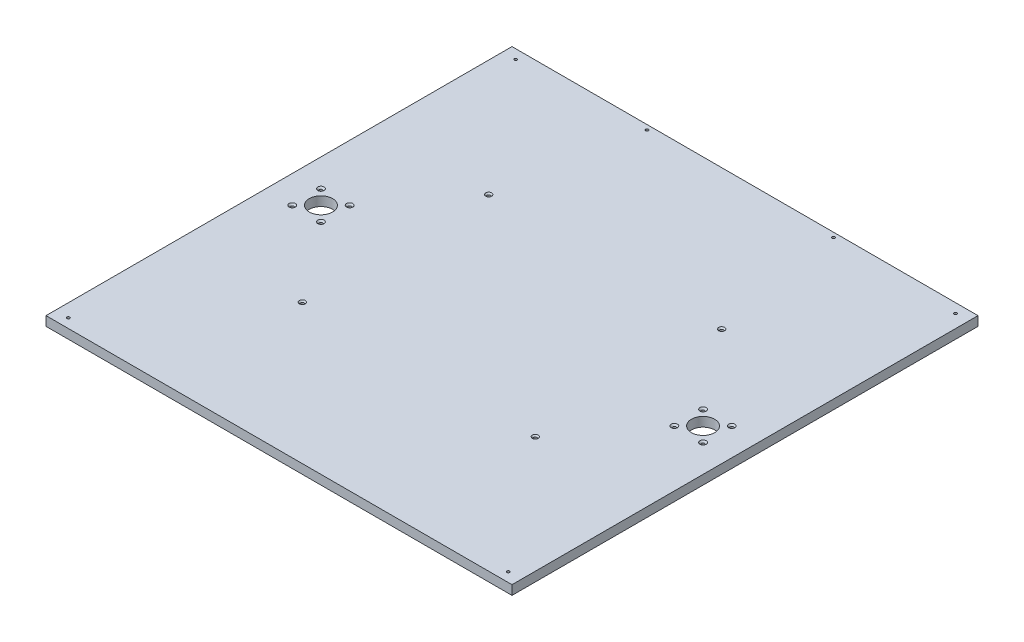
ISO-10303-21;
HEADER;
FILE_DESCRIPTION(('STEP AP214'),'2;1');
FILE_NAME('part.step','',(''),(''),'','','');
FILE_SCHEMA(('AUTOMOTIVE_DESIGN { 1 0 10303 214 1 1 1 1 }'));
ENDSEC;
DATA;
#1=APPLICATION_CONTEXT('core data for automotive mechanical design processes');
#2=APPLICATION_PROTOCOL_DEFINITION('international standard','automotive_design',2000,#1);
#3=PRODUCT_CONTEXT('',#1,'mechanical');
#4=PRODUCT('Part','Part','',(#3));
#5=PRODUCT_RELATED_PRODUCT_CATEGORY('part','',(#4));
#6=PRODUCT_DEFINITION_FORMATION('','',#4);
#7=PRODUCT_DEFINITION_CONTEXT('part definition',#1,'design');
#8=PRODUCT_DEFINITION('design','',#6,#7);
#9=PRODUCT_DEFINITION_SHAPE('','',#8);
#10=(LENGTH_UNIT() NAMED_UNIT(*) SI_UNIT(.MILLI.,.METRE.));
#11=(NAMED_UNIT(*) PLANE_ANGLE_UNIT() SI_UNIT($,.RADIAN.));
#12=(NAMED_UNIT(*) SI_UNIT($,.STERADIAN.) SOLID_ANGLE_UNIT());
#13=UNCERTAINTY_MEASURE_WITH_UNIT(LENGTH_MEASURE(1.E-05),#10,'distance_accuracy_value','');
#14=(GEOMETRIC_REPRESENTATION_CONTEXT(3) GLOBAL_UNCERTAINTY_ASSIGNED_CONTEXT((#13)) GLOBAL_UNIT_ASSIGNED_CONTEXT((#10,
#11,#12)) REPRESENTATION_CONTEXT('',''));
#15=CARTESIAN_POINT('',(0.,0.,0.));
#16=DIRECTION('',(0.,0.,1.));
#17=DIRECTION('',(1.,0.,0.));
#18=AXIS2_PLACEMENT_3D('',#15,#16,#17);
#19=CARTESIAN_POINT('',(0.,10.,0.));
#20=DIRECTION('',(1.,0.,0.));
#21=DIRECTION('',(0.,0.,-1.));
#22=AXIS2_PLACEMENT_3D('',#19,#20,#21);
#23=PLANE('',#22);
#24=DIRECTION('',(0.,0.,1.));
#25=VECTOR('',#24,1.);
#26=CARTESIAN_POINT('',(0.,0.,0.));
#27=LINE('',#26,#25);
#28=CARTESIAN_POINT('',(0.,0.,-500.));
#29=VERTEX_POINT('',#28);
#30=CARTESIAN_POINT('',(0.,0.,0.));
#31=VERTEX_POINT('',#30);
#32=EDGE_CURVE('E103',#29,#31,#27,.T.);
#33=ORIENTED_EDGE('',*,*,#32,.T.);
#34=DIRECTION('',(0.,-1.,0.));
#35=VECTOR('',#34,1.);
#36=CARTESIAN_POINT('',(0.,10.,0.));
#37=LINE('',#36,#35);
#38=CARTESIAN_POINT('',(0.,10.,0.));
#39=VERTEX_POINT('',#38);
#40=EDGE_CURVE('E11',#39,#31,#37,.T.);
#41=ORIENTED_EDGE('',*,*,#40,.F.);
#42=DIRECTION('',(0.,0.,1.));
#43=VECTOR('',#42,1.);
#44=CARTESIAN_POINT('',(0.,10.,0.));
#45=LINE('',#44,#43);
#46=CARTESIAN_POINT('',(0.,10.,-500.));
#47=VERTEX_POINT('',#46);
#48=EDGE_CURVE('E91',#47,#39,#45,.T.);
#49=ORIENTED_EDGE('',*,*,#48,.F.);
#50=DIRECTION('',(0.,-1.,0.));
#51=VECTOR('',#50,1.);
#52=CARTESIAN_POINT('',(0.,10.,-500.));
#53=LINE('',#52,#51);
#54=EDGE_CURVE('E99',#47,#29,#53,.T.);
#55=ORIENTED_EDGE('',*,*,#54,.T.);
#56=EDGE_LOOP('',(#33,#41,#49,#55));
#57=FACE_BOUND('',#56,.T.);
#58=ADVANCED_FACE('F40',(#57),#23,.F.);
#59=CARTESIAN_POINT('',(0.,10.,0.));
#60=DIRECTION('',(0.,0.,-1.));
#61=DIRECTION('',(-1.,0.,0.));
#62=AXIS2_PLACEMENT_3D('',#59,#60,#61);
#63=PLANE('',#62);
#64=DIRECTION('',(1.,0.,0.));
#65=VECTOR('',#64,1.);
#66=CARTESIAN_POINT('',(0.,0.,0.));
#67=LINE('',#66,#65);
#68=CARTESIAN_POINT('',(500.,0.,0.));
#69=VERTEX_POINT('',#68);
#70=EDGE_CURVE('E95',#31,#69,#67,.T.);
#71=ORIENTED_EDGE('',*,*,#70,.T.);
#72=DIRECTION('',(0.,-1.,0.));
#73=VECTOR('',#72,1.);
#74=CARTESIAN_POINT('',(500.,10.,0.));
#75=LINE('',#74,#73);
#76=CARTESIAN_POINT('',(500.,10.,0.));
#77=VERTEX_POINT('',#76);
#78=EDGE_CURVE('E48',#77,#69,#75,.T.);
#79=ORIENTED_EDGE('',*,*,#78,.F.);
#80=DIRECTION('',(1.,0.,0.));
#81=VECTOR('',#80,1.);
#82=CARTESIAN_POINT('',(0.,10.,0.));
#83=LINE('',#82,#81);
#84=EDGE_CURVE('E86',#39,#77,#83,.T.);
#85=ORIENTED_EDGE('',*,*,#84,.F.);
#86=ORIENTED_EDGE('',*,*,#40,.T.);
#87=EDGE_LOOP('',(#71,#79,#85,#86));
#88=FACE_BOUND('',#87,.T.);
#89=ADVANCED_FACE('F94',(#88),#63,.F.);
#90=CARTESIAN_POINT('',(500.,10.,0.));
#91=DIRECTION('',(-1.,0.,0.));
#92=DIRECTION('',(0.,0.,1.));
#93=AXIS2_PLACEMENT_3D('',#90,#91,#92);
#94=PLANE('',#93);
#95=DIRECTION('',(0.,0.,-1.));
#96=VECTOR('',#95,1.);
#97=CARTESIAN_POINT('',(500.,0.,0.));
#98=LINE('',#97,#96);
#99=CARTESIAN_POINT('',(500.,0.,-500.));
#100=VERTEX_POINT('',#99);
#101=EDGE_CURVE('E73',#69,#100,#98,.T.);
#102=ORIENTED_EDGE('',*,*,#101,.T.);
#103=DIRECTION('',(0.,-1.,0.));
#104=VECTOR('',#103,1.);
#105=CARTESIAN_POINT('',(500.,10.,-500.));
#106=LINE('',#105,#104);
#107=CARTESIAN_POINT('',(500.,10.,-500.));
#108=VERTEX_POINT('',#107);
#109=EDGE_CURVE('E96',#108,#100,#106,.T.);
#110=ORIENTED_EDGE('',*,*,#109,.F.);
#111=DIRECTION('',(0.,0.,-1.));
#112=VECTOR('',#111,1.);
#113=CARTESIAN_POINT('',(500.,10.,0.));
#114=LINE('',#113,#112);
#115=EDGE_CURVE('E89',#77,#108,#114,.T.);
#116=ORIENTED_EDGE('',*,*,#115,.F.);
#117=ORIENTED_EDGE('',*,*,#78,.T.);
#118=EDGE_LOOP('',(#102,#110,#116,#117));
#119=FACE_BOUND('',#118,.T.);
#120=ADVANCED_FACE('F97',(#119),#94,.F.);
#121=CARTESIAN_POINT('',(0.,10.,-500.));
#122=DIRECTION('',(0.,0.,1.));
#123=DIRECTION('',(1.,0.,0.));
#124=AXIS2_PLACEMENT_3D('',#121,#122,#123);
#125=PLANE('',#124);
#126=DIRECTION('',(-1.,0.,0.));
#127=VECTOR('',#126,1.);
#128=CARTESIAN_POINT('',(0.,0.,-500.));
#129=LINE('',#128,#127);
#130=EDGE_CURVE('E79',#100,#29,#129,.T.);
#131=ORIENTED_EDGE('',*,*,#130,.T.);
#132=ORIENTED_EDGE('',*,*,#54,.F.);
#133=DIRECTION('',(-1.,0.,0.));
#134=VECTOR('',#133,1.);
#135=CARTESIAN_POINT('',(0.,10.,-500.));
#136=LINE('',#135,#134);
#137=EDGE_CURVE('E56',#108,#47,#136,.T.);
#138=ORIENTED_EDGE('',*,*,#137,.F.);
#139=ORIENTED_EDGE('',*,*,#109,.T.);
#140=EDGE_LOOP('',(#131,#132,#138,#139));
#141=FACE_BOUND('',#140,.T.);
#142=ADVANCED_FACE('F111',(#141),#125,.F.);
#143=CARTESIAN_POINT('',(0.,10.,0.));
#144=DIRECTION('',(0.,-1.,0.));
#145=DIRECTION('',(0.,0.,-1.));
#146=AXIS2_PLACEMENT_3D('',#143,#144,#145);
#147=PLANE('',#146);
#148=CARTESIAN_POINT('',(150.,9.99999999999999,-495.));
#149=DIRECTION('',(0.,-1.,0.));
#150=DIRECTION('',(0.,0.,-1.));
#151=AXIS2_PLACEMENT_3D('',#148,#149,#150);
#152=CIRCLE('',#151,1.5);
#153=CARTESIAN_POINT('',(150.,9.99999999999999,-496.5));
#154=VERTEX_POINT('',#153);
#155=EDGE_CURVE('E266',#154,#154,#152,.T.);
#156=ORIENTED_EDGE('',*,*,#155,.T.);
#157=EDGE_LOOP('',(#156));
#158=FACE_BOUND('',#157,.T.);
#159=CARTESIAN_POINT('',(350.,9.99999999999999,-495.));
#160=DIRECTION('',(0.,-1.,0.));
#161=DIRECTION('',(0.,0.,-1.));
#162=AXIS2_PLACEMENT_3D('',#159,#160,#161);
#163=CIRCLE('',#162,1.5);
#164=CARTESIAN_POINT('',(350.,9.99999999999999,-496.5));
#165=VERTEX_POINT('',#164);
#166=EDGE_CURVE('E260',#165,#165,#163,.T.);
#167=ORIENTED_EDGE('',*,*,#166,.T.);
#168=EDGE_LOOP('',(#167));
#169=FACE_BOUND('',#168,.T.);
#170=CARTESIAN_POINT('',(485.999999999998,10.,-490.));
#171=DIRECTION('',(0.,-1.,0.));
#172=DIRECTION('',(0.,0.,-1.));
#173=AXIS2_PLACEMENT_3D('',#170,#171,#172);
#174=CIRCLE('',#173,1.5);
#175=CARTESIAN_POINT('',(485.999999999998,10.,-491.5));
#176=VERTEX_POINT('',#175);
#177=EDGE_CURVE('E254',#176,#176,#174,.T.);
#178=ORIENTED_EDGE('',*,*,#177,.T.);
#179=EDGE_LOOP('',(#178));
#180=FACE_BOUND('',#179,.T.);
#181=CARTESIAN_POINT('',(485.999999999998,10.,-10.));
#182=DIRECTION('',(0.,-1.,0.));
#183=DIRECTION('',(0.,0.,-1.));
#184=AXIS2_PLACEMENT_3D('',#181,#182,#183);
#185=CIRCLE('',#184,1.5);
#186=CARTESIAN_POINT('',(485.999999999998,10.,-11.5));
#187=VERTEX_POINT('',#186);
#188=EDGE_CURVE('E248',#187,#187,#185,.T.);
#189=ORIENTED_EDGE('',*,*,#188,.T.);
#190=EDGE_LOOP('',(#189));
#191=FACE_BOUND('',#190,.T.);
#192=CARTESIAN_POINT('',(14.0000000000014,10.,-10.));
#193=DIRECTION('',(0.,-1.,0.));
#194=DIRECTION('',(0.,0.,-1.));
#195=AXIS2_PLACEMENT_3D('',#192,#193,#194);
#196=CIRCLE('',#195,1.5);
#197=CARTESIAN_POINT('',(14.0000000000014,10.,-11.5));
#198=VERTEX_POINT('',#197);
#199=EDGE_CURVE('E242',#198,#198,#196,.T.);
#200=ORIENTED_EDGE('',*,*,#199,.T.);
#201=EDGE_LOOP('',(#200));
#202=FACE_BOUND('',#201,.T.);
#203=CARTESIAN_POINT('',(14.0000000000014,10.,-490.));
#204=DIRECTION('',(0.,-1.,0.));
#205=DIRECTION('',(0.,0.,-1.));
#206=AXIS2_PLACEMENT_3D('',#203,#204,#205);
#207=CIRCLE('',#206,1.5);
#208=CARTESIAN_POINT('',(14.0000000000014,10.,-491.5));
#209=VERTEX_POINT('',#208);
#210=EDGE_CURVE('E236',#209,#209,#207,.T.);
#211=ORIENTED_EDGE('',*,*,#210,.T.);
#212=EDGE_LOOP('',(#211));
#213=FACE_BOUND('',#212,.T.);
#214=CARTESIAN_POINT('',(374.999999999999,10.,-350.));
#215=DIRECTION('',(0.,1.,0.));
#216=DIRECTION('',(0.,0.,1.));
#217=AXIS2_PLACEMENT_3D('',#214,#215,#216);
#218=CIRCLE('',#217,3.14999999999999);
#219=CARTESIAN_POINT('',(374.999999999999,10.,-346.85));
#220=VERTEX_POINT('',#219);
#221=EDGE_CURVE('E233',#220,#220,#218,.T.);
#222=ORIENTED_EDGE('',*,*,#221,.F.);
#223=EDGE_LOOP('',(#222));
#224=FACE_BOUND('',#223,.T.);
#225=CARTESIAN_POINT('',(375.,10.,-150.));
#226=DIRECTION('',(0.,1.,0.));
#227=DIRECTION('',(0.,0.,1.));
#228=AXIS2_PLACEMENT_3D('',#225,#226,#227);
#229=CIRCLE('',#228,3.14999999999999);
#230=CARTESIAN_POINT('',(375.,10.,-146.85));
#231=VERTEX_POINT('',#230);
#232=EDGE_CURVE('E224',#231,#231,#229,.T.);
#233=ORIENTED_EDGE('',*,*,#232,.F.);
#234=EDGE_LOOP('',(#233));
#235=FACE_BOUND('',#234,.T.);
#236=CARTESIAN_POINT('',(124.999999999999,10.,-350.));
#237=DIRECTION('',(0.,1.,0.));
#238=DIRECTION('',(0.,0.,1.));
#239=AXIS2_PLACEMENT_3D('',#236,#237,#238);
#240=CIRCLE('',#239,3.15);
#241=CARTESIAN_POINT('',(124.999999999999,10.,-346.85));
#242=VERTEX_POINT('',#241);
#243=EDGE_CURVE('E215',#242,#242,#240,.T.);
#244=ORIENTED_EDGE('',*,*,#243,.F.);
#245=EDGE_LOOP('',(#244));
#246=FACE_BOUND('',#245,.T.);
#247=CARTESIAN_POINT('',(125.,10.,-150.));
#248=DIRECTION('',(0.,1.,0.));
#249=DIRECTION('',(0.,0.,1.));
#250=AXIS2_PLACEMENT_3D('',#247,#248,#249);
#251=CIRCLE('',#250,3.14999999999999);
#252=CARTESIAN_POINT('',(125.,10.,-146.85));
#253=VERTEX_POINT('',#252);
#254=EDGE_CURVE('E206',#253,#253,#251,.T.);
#255=ORIENTED_EDGE('',*,*,#254,.F.);
#256=EDGE_LOOP('',(#255));
#257=FACE_BOUND('',#256,.T.);
#258=CARTESIAN_POINT('',(439.6,10.,-265.4));
#259=DIRECTION('',(0.,1.,0.));
#260=DIRECTION('',(0.,0.,1.));
#261=AXIS2_PLACEMENT_3D('',#258,#259,#260);
#262=CIRCLE('',#261,3.35999999999997);
#263=CARTESIAN_POINT('',(439.6,10.,-262.04));
#264=VERTEX_POINT('',#263);
#265=EDGE_CURVE('E197',#264,#264,#262,.T.);
#266=ORIENTED_EDGE('',*,*,#265,.F.);
#267=EDGE_LOOP('',(#266));
#268=FACE_BOUND('',#267,.T.);
#269=CARTESIAN_POINT('',(439.6,10.,-234.6));
#270=DIRECTION('',(0.,1.,0.));
#271=DIRECTION('',(0.,0.,1.));
#272=AXIS2_PLACEMENT_3D('',#269,#270,#271);
#273=CIRCLE('',#272,3.35999999999997);
#274=CARTESIAN_POINT('',(439.6,10.,-231.24));
#275=VERTEX_POINT('',#274);
#276=EDGE_CURVE('E188',#275,#275,#273,.T.);
#277=ORIENTED_EDGE('',*,*,#276,.F.);
#278=EDGE_LOOP('',(#277));
#279=FACE_BOUND('',#278,.T.);
#280=CARTESIAN_POINT('',(470.4,10.,-234.6));
#281=DIRECTION('',(0.,1.,0.));
#282=DIRECTION('',(0.,0.,1.));
#283=AXIS2_PLACEMENT_3D('',#280,#281,#282);
#284=CIRCLE('',#283,3.35999999999997);
#285=CARTESIAN_POINT('',(470.4,10.,-231.24));
#286=VERTEX_POINT('',#285);
#287=EDGE_CURVE('E179',#286,#286,#284,.T.);
#288=ORIENTED_EDGE('',*,*,#287,.F.);
#289=EDGE_LOOP('',(#288));
#290=FACE_BOUND('',#289,.T.);
#291=CARTESIAN_POINT('',(470.4,10.,-265.4));
#292=DIRECTION('',(0.,1.,0.));
#293=DIRECTION('',(0.,0.,1.));
#294=AXIS2_PLACEMENT_3D('',#291,#292,#293);
#295=CIRCLE('',#294,3.35999999999997);
#296=CARTESIAN_POINT('',(470.4,10.,-262.04));
#297=VERTEX_POINT('',#296);
#298=EDGE_CURVE('E170',#297,#297,#295,.T.);
#299=ORIENTED_EDGE('',*,*,#298,.F.);
#300=EDGE_LOOP('',(#299));
#301=FACE_BOUND('',#300,.T.);
#302=CARTESIAN_POINT('',(60.4,10.,-234.6));
#303=DIRECTION('',(0.,1.,0.));
#304=DIRECTION('',(0.,0.,1.));
#305=AXIS2_PLACEMENT_3D('',#302,#303,#304);
#306=CIRCLE('',#305,3.36);
#307=CARTESIAN_POINT('',(60.4,10.,-231.24));
#308=VERTEX_POINT('',#307);
#309=EDGE_CURVE('E161',#308,#308,#306,.T.);
#310=ORIENTED_EDGE('',*,*,#309,.F.);
#311=EDGE_LOOP('',(#310));
#312=FACE_BOUND('',#311,.T.);
#313=CARTESIAN_POINT('',(60.4,10.,-265.4));
#314=DIRECTION('',(0.,1.,0.));
#315=DIRECTION('',(0.,0.,1.));
#316=AXIS2_PLACEMENT_3D('',#313,#314,#315);
#317=CIRCLE('',#316,3.36);
#318=CARTESIAN_POINT('',(60.4,10.,-262.04));
#319=VERTEX_POINT('',#318);
#320=EDGE_CURVE('E152',#319,#319,#317,.T.);
#321=ORIENTED_EDGE('',*,*,#320,.F.);
#322=EDGE_LOOP('',(#321));
#323=FACE_BOUND('',#322,.T.);
#324=CARTESIAN_POINT('',(29.6,10.,-234.6));
#325=DIRECTION('',(0.,1.,0.));
#326=DIRECTION('',(0.,0.,1.));
#327=AXIS2_PLACEMENT_3D('',#324,#325,#326);
#328=CIRCLE('',#327,3.36);
#329=CARTESIAN_POINT('',(29.6,10.,-231.24));
#330=VERTEX_POINT('',#329);
#331=EDGE_CURVE('E143',#330,#330,#328,.T.);
#332=ORIENTED_EDGE('',*,*,#331,.F.);
#333=EDGE_LOOP('',(#332));
#334=FACE_BOUND('',#333,.T.);
#335=CARTESIAN_POINT('',(29.6,10.,-265.4));
#336=DIRECTION('',(0.,1.,0.));
#337=DIRECTION('',(0.,0.,1.));
#338=AXIS2_PLACEMENT_3D('',#335,#336,#337);
#339=CIRCLE('',#338,3.36);
#340=CARTESIAN_POINT('',(29.6,10.,-262.04));
#341=VERTEX_POINT('',#340);
#342=EDGE_CURVE('E134',#341,#341,#339,.T.);
#343=ORIENTED_EDGE('',*,*,#342,.F.);
#344=EDGE_LOOP('',(#343));
#345=FACE_BOUND('',#344,.T.);
#346=CARTESIAN_POINT('',(45.,10.,-250.));
#347=DIRECTION('',(0.,1.,0.));
#348=DIRECTION('',(0.,0.,1.));
#349=AXIS2_PLACEMENT_3D('',#346,#347,#348);
#350=CIRCLE('',#349,12.5);
#351=CARTESIAN_POINT('',(45.,10.,-237.5));
#352=VERTEX_POINT('',#351);
#353=EDGE_CURVE('E124',#352,#352,#350,.T.);
#354=ORIENTED_EDGE('',*,*,#353,.F.);
#355=EDGE_LOOP('',(#354));
#356=FACE_BOUND('',#355,.T.);
#357=CARTESIAN_POINT('',(455.,10.,-250.));
#358=DIRECTION('',(0.,1.,0.));
#359=DIRECTION('',(0.,0.,1.));
#360=AXIS2_PLACEMENT_3D('',#357,#358,#359);
#361=CIRCLE('',#360,12.5);
#362=CARTESIAN_POINT('',(455.,10.,-237.5));
#363=VERTEX_POINT('',#362);
#364=EDGE_CURVE('E117',#363,#363,#361,.T.);
#365=ORIENTED_EDGE('',*,*,#364,.F.);
#366=EDGE_LOOP('',(#365));
#367=FACE_BOUND('',#366,.T.);
#368=ORIENTED_EDGE('',*,*,#48,.T.);
#369=ORIENTED_EDGE('',*,*,#84,.T.);
#370=ORIENTED_EDGE('',*,*,#115,.T.);
#371=ORIENTED_EDGE('',*,*,#137,.T.);
#372=EDGE_LOOP('',(#368,#369,#370,#371));
#373=FACE_BOUND('',#372,.T.);
#374=ADVANCED_FACE('F87',(#158,#169,#180,#191,#202,#213,#224,#235,#246,#257,#268,#279,#290,#301,
#312,#323,#334,#345,#356,#367,#373),#147,.F.);
#375=CARTESIAN_POINT('',(0.,0.,0.));
#376=DIRECTION('',(0.,-1.,0.));
#377=DIRECTION('',(0.,0.,-1.));
#378=AXIS2_PLACEMENT_3D('',#375,#376,#377);
#379=PLANE('',#378);
#380=CARTESIAN_POINT('',(150.,0.,-495.));
#381=DIRECTION('',(0.,-1.,0.));
#382=DIRECTION('',(0.,0.,-1.));
#383=AXIS2_PLACEMENT_3D('',#380,#381,#382);
#384=CIRCLE('',#383,1.5);
#385=CARTESIAN_POINT('',(150.,0.,-496.5));
#386=VERTEX_POINT('',#385);
#387=EDGE_CURVE('E269',#386,#386,#384,.T.);
#388=ORIENTED_EDGE('',*,*,#387,.F.);
#389=EDGE_LOOP('',(#388));
#390=FACE_BOUND('',#389,.T.);
#391=CARTESIAN_POINT('',(350.,0.,-495.));
#392=DIRECTION('',(0.,-1.,0.));
#393=DIRECTION('',(0.,0.,-1.));
#394=AXIS2_PLACEMENT_3D('',#391,#392,#393);
#395=CIRCLE('',#394,1.5);
#396=CARTESIAN_POINT('',(350.,0.,-496.5));
#397=VERTEX_POINT('',#396);
#398=EDGE_CURVE('E263',#397,#397,#395,.T.);
#399=ORIENTED_EDGE('',*,*,#398,.F.);
#400=EDGE_LOOP('',(#399));
#401=FACE_BOUND('',#400,.T.);
#402=CARTESIAN_POINT('',(485.999999999998,0.,-490.));
#403=DIRECTION('',(0.,-1.,0.));
#404=DIRECTION('',(0.,0.,-1.));
#405=AXIS2_PLACEMENT_3D('',#402,#403,#404);
#406=CIRCLE('',#405,1.5);
#407=CARTESIAN_POINT('',(485.999999999998,0.,-491.5));
#408=VERTEX_POINT('',#407);
#409=EDGE_CURVE('E257',#408,#408,#406,.T.);
#410=ORIENTED_EDGE('',*,*,#409,.F.);
#411=EDGE_LOOP('',(#410));
#412=FACE_BOUND('',#411,.T.);
#413=CARTESIAN_POINT('',(485.999999999998,0.,-10.));
#414=DIRECTION('',(0.,-1.,0.));
#415=DIRECTION('',(0.,0.,-1.));
#416=AXIS2_PLACEMENT_3D('',#413,#414,#415);
#417=CIRCLE('',#416,1.5);
#418=CARTESIAN_POINT('',(485.999999999998,0.,-11.5));
#419=VERTEX_POINT('',#418);
#420=EDGE_CURVE('E251',#419,#419,#417,.T.);
#421=ORIENTED_EDGE('',*,*,#420,.F.);
#422=EDGE_LOOP('',(#421));
#423=FACE_BOUND('',#422,.T.);
#424=CARTESIAN_POINT('',(14.0000000000014,0.,-10.));
#425=DIRECTION('',(0.,-1.,0.));
#426=DIRECTION('',(0.,0.,-1.));
#427=AXIS2_PLACEMENT_3D('',#424,#425,#426);
#428=CIRCLE('',#427,1.5);
#429=CARTESIAN_POINT('',(14.0000000000014,0.,-11.5));
#430=VERTEX_POINT('',#429);
#431=EDGE_CURVE('E245',#430,#430,#428,.T.);
#432=ORIENTED_EDGE('',*,*,#431,.F.);
#433=EDGE_LOOP('',(#432));
#434=FACE_BOUND('',#433,.T.);
#435=CARTESIAN_POINT('',(14.0000000000014,0.,-490.));
#436=DIRECTION('',(0.,-1.,0.));
#437=DIRECTION('',(0.,0.,-1.));
#438=AXIS2_PLACEMENT_3D('',#435,#436,#437);
#439=CIRCLE('',#438,1.5);
#440=CARTESIAN_POINT('',(14.0000000000014,0.,-491.5));
#441=VERTEX_POINT('',#440);
#442=EDGE_CURVE('E239',#441,#441,#439,.T.);
#443=ORIENTED_EDGE('',*,*,#442,.F.);
#444=EDGE_LOOP('',(#443));
#445=FACE_BOUND('',#444,.T.);
#446=CARTESIAN_POINT('',(374.999999999999,0.,-350.));
#447=DIRECTION('',(0.,1.,0.));
#448=DIRECTION('',(0.,0.,1.));
#449=AXIS2_PLACEMENT_3D('',#446,#447,#448);
#450=CIRCLE('',#449,1.69999999999998);
#451=CARTESIAN_POINT('',(374.999999999999,0.,-348.3));
#452=VERTEX_POINT('',#451);
#453=EDGE_CURVE('E227',#452,#452,#450,.T.);
#454=ORIENTED_EDGE('',*,*,#453,.T.);
#455=EDGE_LOOP('',(#454));
#456=FACE_BOUND('',#455,.T.);
#457=CARTESIAN_POINT('',(375.,0.,-150.));
#458=DIRECTION('',(0.,1.,0.));
#459=DIRECTION('',(0.,0.,1.));
#460=AXIS2_PLACEMENT_3D('',#457,#458,#459);
#461=CIRCLE('',#460,1.69999999999998);
#462=CARTESIAN_POINT('',(375.,0.,-148.3));
#463=VERTEX_POINT('',#462);
#464=EDGE_CURVE('E218',#463,#463,#461,.T.);
#465=ORIENTED_EDGE('',*,*,#464,.T.);
#466=EDGE_LOOP('',(#465));
#467=FACE_BOUND('',#466,.T.);
#468=CARTESIAN_POINT('',(124.999999999999,0.,-350.));
#469=DIRECTION('',(0.,1.,0.));
#470=DIRECTION('',(0.,0.,1.));
#471=AXIS2_PLACEMENT_3D('',#468,#469,#470);
#472=CIRCLE('',#471,1.69999999999999);
#473=CARTESIAN_POINT('',(124.999999999999,0.,-348.3));
#474=VERTEX_POINT('',#473);
#475=EDGE_CURVE('E209',#474,#474,#472,.T.);
#476=ORIENTED_EDGE('',*,*,#475,.T.);
#477=EDGE_LOOP('',(#476));
#478=FACE_BOUND('',#477,.T.);
#479=CARTESIAN_POINT('',(125.,0.,-150.));
#480=DIRECTION('',(0.,1.,0.));
#481=DIRECTION('',(0.,0.,1.));
#482=AXIS2_PLACEMENT_3D('',#479,#480,#481);
#483=CIRCLE('',#482,1.70000000000001);
#484=CARTESIAN_POINT('',(125.,0.,-148.3));
#485=VERTEX_POINT('',#484);
#486=EDGE_CURVE('E200',#485,#485,#483,.T.);
#487=ORIENTED_EDGE('',*,*,#486,.T.);
#488=EDGE_LOOP('',(#487));
#489=FACE_BOUND('',#488,.T.);
#490=CARTESIAN_POINT('',(439.6,0.,-265.4));
#491=DIRECTION('',(0.,1.,0.));
#492=DIRECTION('',(0.,0.,1.));
#493=AXIS2_PLACEMENT_3D('',#490,#491,#492);
#494=CIRCLE('',#493,1.69999999999998);
#495=CARTESIAN_POINT('',(439.6,0.,-263.7));
#496=VERTEX_POINT('',#495);
#497=EDGE_CURVE('E191',#496,#496,#494,.T.);
#498=ORIENTED_EDGE('',*,*,#497,.T.);
#499=EDGE_LOOP('',(#498));
#500=FACE_BOUND('',#499,.T.);
#501=CARTESIAN_POINT('',(439.6,0.,-234.6));
#502=DIRECTION('',(0.,1.,0.));
#503=DIRECTION('',(0.,0.,1.));
#504=AXIS2_PLACEMENT_3D('',#501,#502,#503);
#505=CIRCLE('',#504,1.69999999999998);
#506=CARTESIAN_POINT('',(439.6,0.,-232.9));
#507=VERTEX_POINT('',#506);
#508=EDGE_CURVE('E182',#507,#507,#505,.T.);
#509=ORIENTED_EDGE('',*,*,#508,.T.);
#510=EDGE_LOOP('',(#509));
#511=FACE_BOUND('',#510,.T.);
#512=CARTESIAN_POINT('',(470.4,0.,-234.6));
#513=DIRECTION('',(0.,1.,0.));
#514=DIRECTION('',(0.,0.,1.));
#515=AXIS2_PLACEMENT_3D('',#512,#513,#514);
#516=CIRCLE('',#515,1.69999999999998);
#517=CARTESIAN_POINT('',(470.4,0.,-232.9));
#518=VERTEX_POINT('',#517);
#519=EDGE_CURVE('E173',#518,#518,#516,.T.);
#520=ORIENTED_EDGE('',*,*,#519,.T.);
#521=EDGE_LOOP('',(#520));
#522=FACE_BOUND('',#521,.T.);
#523=CARTESIAN_POINT('',(470.4,0.,-265.4));
#524=DIRECTION('',(0.,1.,0.));
#525=DIRECTION('',(0.,0.,1.));
#526=AXIS2_PLACEMENT_3D('',#523,#524,#525);
#527=CIRCLE('',#526,1.69999999999998);
#528=CARTESIAN_POINT('',(470.4,0.,-263.7));
#529=VERTEX_POINT('',#528);
#530=EDGE_CURVE('E164',#529,#529,#527,.T.);
#531=ORIENTED_EDGE('',*,*,#530,.T.);
#532=EDGE_LOOP('',(#531));
#533=FACE_BOUND('',#532,.T.);
#534=CARTESIAN_POINT('',(60.4,0.,-234.6));
#535=DIRECTION('',(0.,1.,0.));
#536=DIRECTION('',(0.,0.,1.));
#537=AXIS2_PLACEMENT_3D('',#534,#535,#536);
#538=CIRCLE('',#537,1.7);
#539=CARTESIAN_POINT('',(60.4,0.,-232.9));
#540=VERTEX_POINT('',#539);
#541=EDGE_CURVE('E155',#540,#540,#538,.T.);
#542=ORIENTED_EDGE('',*,*,#541,.T.);
#543=EDGE_LOOP('',(#542));
#544=FACE_BOUND('',#543,.T.);
#545=CARTESIAN_POINT('',(60.4,0.,-265.4));
#546=DIRECTION('',(0.,1.,0.));
#547=DIRECTION('',(0.,0.,1.));
#548=AXIS2_PLACEMENT_3D('',#545,#546,#547);
#549=CIRCLE('',#548,1.7);
#550=CARTESIAN_POINT('',(60.4,0.,-263.7));
#551=VERTEX_POINT('',#550);
#552=EDGE_CURVE('E146',#551,#551,#549,.T.);
#553=ORIENTED_EDGE('',*,*,#552,.T.);
#554=EDGE_LOOP('',(#553));
#555=FACE_BOUND('',#554,.T.);
#556=CARTESIAN_POINT('',(29.6,0.,-234.6));
#557=DIRECTION('',(0.,1.,0.));
#558=DIRECTION('',(0.,0.,1.));
#559=AXIS2_PLACEMENT_3D('',#556,#557,#558);
#560=CIRCLE('',#559,1.7);
#561=CARTESIAN_POINT('',(29.6,0.,-232.9));
#562=VERTEX_POINT('',#561);
#563=EDGE_CURVE('E137',#562,#562,#560,.T.);
#564=ORIENTED_EDGE('',*,*,#563,.T.);
#565=EDGE_LOOP('',(#564));
#566=FACE_BOUND('',#565,.T.);
#567=CARTESIAN_POINT('',(29.6,0.,-265.4));
#568=DIRECTION('',(0.,1.,0.));
#569=DIRECTION('',(0.,0.,1.));
#570=AXIS2_PLACEMENT_3D('',#567,#568,#569);
#571=CIRCLE('',#570,1.7);
#572=CARTESIAN_POINT('',(29.6,0.,-263.7));
#573=VERTEX_POINT('',#572);
#574=EDGE_CURVE('E121',#573,#573,#571,.T.);
#575=ORIENTED_EDGE('',*,*,#574,.T.);
#576=EDGE_LOOP('',(#575));
#577=FACE_BOUND('',#576,.T.);
#578=CARTESIAN_POINT('',(45.,0.,-250.));
#579=DIRECTION('',(0.,1.,0.));
#580=DIRECTION('',(0.,0.,1.));
#581=AXIS2_PLACEMENT_3D('',#578,#579,#580);
#582=CIRCLE('',#581,12.5);
#583=CARTESIAN_POINT('',(45.,0.,-237.5));
#584=VERTEX_POINT('',#583);
#585=EDGE_CURVE('E106',#584,#584,#582,.T.);
#586=ORIENTED_EDGE('',*,*,#585,.T.);
#587=EDGE_LOOP('',(#586));
#588=FACE_BOUND('',#587,.T.);
#589=CARTESIAN_POINT('',(455.,0.,-250.));
#590=DIRECTION('',(0.,1.,0.));
#591=DIRECTION('',(0.,0.,1.));
#592=AXIS2_PLACEMENT_3D('',#589,#590,#591);
#593=CIRCLE('',#592,12.5);
#594=CARTESIAN_POINT('',(455.,0.,-237.5));
#595=VERTEX_POINT('',#594);
#596=EDGE_CURVE('E120',#595,#595,#593,.T.);
#597=ORIENTED_EDGE('',*,*,#596,.T.);
#598=EDGE_LOOP('',(#597));
#599=FACE_BOUND('',#598,.T.);
#600=ORIENTED_EDGE('',*,*,#32,.F.);
#601=ORIENTED_EDGE('',*,*,#130,.F.);
#602=ORIENTED_EDGE('',*,*,#101,.F.);
#603=ORIENTED_EDGE('',*,*,#70,.F.);
#604=EDGE_LOOP('',(#600,#601,#602,#603));
#605=FACE_BOUND('',#604,.T.);
#606=ADVANCED_FACE('F114',(#390,#401,#412,#423,#434,#445,#456,#467,#478,#489,#500,#511,#522,
#533,#544,#555,#566,#577,#588,#599,#605),#379,.T.);
#607=CARTESIAN_POINT('',(455.,0.,-250.));
#608=DIRECTION('',(0.,1.,0.));
#609=DIRECTION('',(0.,0.,1.));
#610=AXIS2_PLACEMENT_3D('',#607,#608,#609);
#611=CYLINDRICAL_SURFACE('',#610,12.5);
#612=ORIENTED_EDGE('',*,*,#596,.F.);
#613=EDGE_LOOP('',(#612));
#614=FACE_BOUND('',#613,.T.);
#615=ORIENTED_EDGE('',*,*,#364,.T.);
#616=EDGE_LOOP('',(#615));
#617=FACE_BOUND('',#616,.T.);
#618=ADVANCED_FACE('F277',(#614,#617),#611,.F.);
#619=CARTESIAN_POINT('',(45.,0.,-250.));
#620=DIRECTION('',(0.,1.,0.));
#621=DIRECTION('',(0.,0.,1.));
#622=AXIS2_PLACEMENT_3D('',#619,#620,#621);
#623=CYLINDRICAL_SURFACE('',#622,12.5);
#624=ORIENTED_EDGE('',*,*,#585,.F.);
#625=EDGE_LOOP('',(#624));
#626=FACE_BOUND('',#625,.T.);
#627=ORIENTED_EDGE('',*,*,#353,.T.);
#628=EDGE_LOOP('',(#627));
#629=FACE_BOUND('',#628,.T.);
#630=ADVANCED_FACE('F319',(#626,#629),#623,.F.);
#631=CARTESIAN_POINT('',(29.6,10.,-265.4));
#632=DIRECTION('',(0.,1.,0.));
#633=DIRECTION('',(0.,0.,1.));
#634=AXIS2_PLACEMENT_3D('',#631,#632,#633);
#635=CYLINDRICAL_SURFACE('',#634,1.7);
#636=ORIENTED_EDGE('',*,*,#574,.F.);
#637=EDGE_LOOP('',(#636));
#638=FACE_BOUND('',#637,.T.);
#639=CARTESIAN_POINT('',(29.6,8.34,-265.4));
#640=DIRECTION('',(0.,1.,0.));
#641=DIRECTION('',(0.,0.,1.));
#642=AXIS2_PLACEMENT_3D('',#639,#640,#641);
#643=CIRCLE('',#642,1.7);
#644=CARTESIAN_POINT('',(29.6,8.34,-263.7));
#645=VERTEX_POINT('',#644);
#646=EDGE_CURVE('E131',#645,#645,#643,.T.);
#647=ORIENTED_EDGE('',*,*,#646,.T.);
#648=EDGE_LOOP('',(#647));
#649=FACE_BOUND('',#648,.T.);
#650=ADVANCED_FACE('F362',(#638,#649),#635,.F.);
#651=CARTESIAN_POINT('',(29.6,10.,-265.4));
#652=DIRECTION('',(0.,1.,0.));
#653=DIRECTION('',(0.,0.,1.));
#654=AXIS2_PLACEMENT_3D('',#651,#652,#653);
#655=CONICAL_SURFACE('',#654,3.36,0.785398163397449);
#656=ORIENTED_EDGE('',*,*,#646,.F.);
#657=EDGE_LOOP('',(#656));
#658=FACE_BOUND('',#657,.T.);
#659=ORIENTED_EDGE('',*,*,#342,.T.);
#660=EDGE_LOOP('',(#659));
#661=FACE_BOUND('',#660,.T.);
#662=ADVANCED_FACE('F372',(#658,#661),#655,.F.);
#663=CARTESIAN_POINT('',(29.6,10.,-234.6));
#664=DIRECTION('',(0.,1.,0.));
#665=DIRECTION('',(0.,0.,1.));
#666=AXIS2_PLACEMENT_3D('',#663,#664,#665);
#667=CYLINDRICAL_SURFACE('',#666,1.7);
#668=ORIENTED_EDGE('',*,*,#563,.F.);
#669=EDGE_LOOP('',(#668));
#670=FACE_BOUND('',#669,.T.);
#671=CARTESIAN_POINT('',(29.6,8.34,-234.6));
#672=DIRECTION('',(0.,1.,0.));
#673=DIRECTION('',(0.,0.,1.));
#674=AXIS2_PLACEMENT_3D('',#671,#672,#673);
#675=CIRCLE('',#674,1.7);
#676=CARTESIAN_POINT('',(29.6,8.34,-232.9));
#677=VERTEX_POINT('',#676);
#678=EDGE_CURVE('E140',#677,#677,#675,.T.);
#679=ORIENTED_EDGE('',*,*,#678,.T.);
#680=EDGE_LOOP('',(#679));
#681=FACE_BOUND('',#680,.T.);
#682=ADVANCED_FACE('F382',(#670,#681),#667,.F.);
#683=CARTESIAN_POINT('',(29.6,10.,-234.6));
#684=DIRECTION('',(0.,1.,0.));
#685=DIRECTION('',(0.,0.,1.));
#686=AXIS2_PLACEMENT_3D('',#683,#684,#685);
#687=CONICAL_SURFACE('',#686,3.36,0.785398163397449);
#688=ORIENTED_EDGE('',*,*,#678,.F.);
#689=EDGE_LOOP('',(#688));
#690=FACE_BOUND('',#689,.T.);
#691=ORIENTED_EDGE('',*,*,#331,.T.);
#692=EDGE_LOOP('',(#691));
#693=FACE_BOUND('',#692,.T.);
#694=ADVANCED_FACE('F392',(#690,#693),#687,.F.);
#695=CARTESIAN_POINT('',(60.4,10.,-265.4));
#696=DIRECTION('',(0.,1.,0.));
#697=DIRECTION('',(0.,0.,1.));
#698=AXIS2_PLACEMENT_3D('',#695,#696,#697);
#699=CYLINDRICAL_SURFACE('',#698,1.7);
#700=ORIENTED_EDGE('',*,*,#552,.F.);
#701=EDGE_LOOP('',(#700));
#702=FACE_BOUND('',#701,.T.);
#703=CARTESIAN_POINT('',(60.4,8.34,-265.4));
#704=DIRECTION('',(0.,1.,0.));
#705=DIRECTION('',(0.,0.,1.));
#706=AXIS2_PLACEMENT_3D('',#703,#704,#705);
#707=CIRCLE('',#706,1.7);
#708=CARTESIAN_POINT('',(60.4,8.34,-263.7));
#709=VERTEX_POINT('',#708);
#710=EDGE_CURVE('E149',#709,#709,#707,.T.);
#711=ORIENTED_EDGE('',*,*,#710,.T.);
#712=EDGE_LOOP('',(#711));
#713=FACE_BOUND('',#712,.T.);
#714=ADVANCED_FACE('F402',(#702,#713),#699,.F.);
#715=CARTESIAN_POINT('',(60.4,10.,-265.4));
#716=DIRECTION('',(0.,1.,0.));
#717=DIRECTION('',(0.,0.,1.));
#718=AXIS2_PLACEMENT_3D('',#715,#716,#717);
#719=CONICAL_SURFACE('',#718,3.36,0.785398163397449);
#720=ORIENTED_EDGE('',*,*,#710,.F.);
#721=EDGE_LOOP('',(#720));
#722=FACE_BOUND('',#721,.T.);
#723=ORIENTED_EDGE('',*,*,#320,.T.);
#724=EDGE_LOOP('',(#723));
#725=FACE_BOUND('',#724,.T.);
#726=ADVANCED_FACE('F412',(#722,#725),#719,.F.);
#727=CARTESIAN_POINT('',(60.4,10.,-234.6));
#728=DIRECTION('',(0.,1.,0.));
#729=DIRECTION('',(0.,0.,1.));
#730=AXIS2_PLACEMENT_3D('',#727,#728,#729);
#731=CYLINDRICAL_SURFACE('',#730,1.7);
#732=ORIENTED_EDGE('',*,*,#541,.F.);
#733=EDGE_LOOP('',(#732));
#734=FACE_BOUND('',#733,.T.);
#735=CARTESIAN_POINT('',(60.4,8.34,-234.6));
#736=DIRECTION('',(0.,1.,0.));
#737=DIRECTION('',(0.,0.,1.));
#738=AXIS2_PLACEMENT_3D('',#735,#736,#737);
#739=CIRCLE('',#738,1.7);
#740=CARTESIAN_POINT('',(60.4,8.34,-232.9));
#741=VERTEX_POINT('',#740);
#742=EDGE_CURVE('E158',#741,#741,#739,.T.);
#743=ORIENTED_EDGE('',*,*,#742,.T.);
#744=EDGE_LOOP('',(#743));
#745=FACE_BOUND('',#744,.T.);
#746=ADVANCED_FACE('F422',(#734,#745),#731,.F.);
#747=CARTESIAN_POINT('',(60.4,10.,-234.6));
#748=DIRECTION('',(0.,1.,0.));
#749=DIRECTION('',(0.,0.,1.));
#750=AXIS2_PLACEMENT_3D('',#747,#748,#749);
#751=CONICAL_SURFACE('',#750,3.36,0.785398163397449);
#752=ORIENTED_EDGE('',*,*,#742,.F.);
#753=EDGE_LOOP('',(#752));
#754=FACE_BOUND('',#753,.T.);
#755=ORIENTED_EDGE('',*,*,#309,.T.);
#756=EDGE_LOOP('',(#755));
#757=FACE_BOUND('',#756,.T.);
#758=ADVANCED_FACE('F432',(#754,#757),#751,.F.);
#759=CARTESIAN_POINT('',(470.4,10.,-265.4));
#760=DIRECTION('',(0.,1.,0.));
#761=DIRECTION('',(0.,0.,1.));
#762=AXIS2_PLACEMENT_3D('',#759,#760,#761);
#763=CYLINDRICAL_SURFACE('',#762,1.69999999999998);
#764=ORIENTED_EDGE('',*,*,#530,.F.);
#765=EDGE_LOOP('',(#764));
#766=FACE_BOUND('',#765,.T.);
#767=CARTESIAN_POINT('',(470.4,8.34,-265.4));
#768=DIRECTION('',(0.,1.,0.));
#769=DIRECTION('',(0.,0.,1.));
#770=AXIS2_PLACEMENT_3D('',#767,#768,#769);
#771=CIRCLE('',#770,1.69999999999998);
#772=CARTESIAN_POINT('',(470.4,8.34,-263.7));
#773=VERTEX_POINT('',#772);
#774=EDGE_CURVE('E167',#773,#773,#771,.T.);
#775=ORIENTED_EDGE('',*,*,#774,.T.);
#776=EDGE_LOOP('',(#775));
#777=FACE_BOUND('',#776,.T.);
#778=ADVANCED_FACE('F442',(#766,#777),#763,.F.);
#779=CARTESIAN_POINT('',(470.4,10.,-265.4));
#780=DIRECTION('',(0.,1.,0.));
#781=DIRECTION('',(0.,0.,1.));
#782=AXIS2_PLACEMENT_3D('',#779,#780,#781);
#783=CONICAL_SURFACE('',#782,3.35999999999997,0.785398163397447);
#784=ORIENTED_EDGE('',*,*,#774,.F.);
#785=EDGE_LOOP('',(#784));
#786=FACE_BOUND('',#785,.T.);
#787=ORIENTED_EDGE('',*,*,#298,.T.);
#788=EDGE_LOOP('',(#787));
#789=FACE_BOUND('',#788,.T.);
#790=ADVANCED_FACE('F452',(#786,#789),#783,.F.);
#791=CARTESIAN_POINT('',(470.4,10.,-234.6));
#792=DIRECTION('',(0.,1.,0.));
#793=DIRECTION('',(0.,0.,1.));
#794=AXIS2_PLACEMENT_3D('',#791,#792,#793);
#795=CYLINDRICAL_SURFACE('',#794,1.69999999999998);
#796=ORIENTED_EDGE('',*,*,#519,.F.);
#797=EDGE_LOOP('',(#796));
#798=FACE_BOUND('',#797,.T.);
#799=CARTESIAN_POINT('',(470.4,8.34,-234.6));
#800=DIRECTION('',(0.,1.,0.));
#801=DIRECTION('',(0.,0.,1.));
#802=AXIS2_PLACEMENT_3D('',#799,#800,#801);
#803=CIRCLE('',#802,1.69999999999998);
#804=CARTESIAN_POINT('',(470.4,8.34,-232.9));
#805=VERTEX_POINT('',#804);
#806=EDGE_CURVE('E176',#805,#805,#803,.T.);
#807=ORIENTED_EDGE('',*,*,#806,.T.);
#808=EDGE_LOOP('',(#807));
#809=FACE_BOUND('',#808,.T.);
#810=ADVANCED_FACE('F462',(#798,#809),#795,.F.);
#811=CARTESIAN_POINT('',(470.4,10.,-234.6));
#812=DIRECTION('',(0.,1.,0.));
#813=DIRECTION('',(0.,0.,1.));
#814=AXIS2_PLACEMENT_3D('',#811,#812,#813);
#815=CONICAL_SURFACE('',#814,3.35999999999997,0.785398163397447);
#816=ORIENTED_EDGE('',*,*,#806,.F.);
#817=EDGE_LOOP('',(#816));
#818=FACE_BOUND('',#817,.T.);
#819=ORIENTED_EDGE('',*,*,#287,.T.);
#820=EDGE_LOOP('',(#819));
#821=FACE_BOUND('',#820,.T.);
#822=ADVANCED_FACE('F472',(#818,#821),#815,.F.);
#823=CARTESIAN_POINT('',(439.6,10.,-234.6));
#824=DIRECTION('',(0.,1.,0.));
#825=DIRECTION('',(0.,0.,1.));
#826=AXIS2_PLACEMENT_3D('',#823,#824,#825);
#827=CYLINDRICAL_SURFACE('',#826,1.69999999999998);
#828=ORIENTED_EDGE('',*,*,#508,.F.);
#829=EDGE_LOOP('',(#828));
#830=FACE_BOUND('',#829,.T.);
#831=CARTESIAN_POINT('',(439.6,8.34,-234.6));
#832=DIRECTION('',(0.,1.,0.));
#833=DIRECTION('',(0.,0.,1.));
#834=AXIS2_PLACEMENT_3D('',#831,#832,#833);
#835=CIRCLE('',#834,1.69999999999998);
#836=CARTESIAN_POINT('',(439.6,8.34,-232.9));
#837=VERTEX_POINT('',#836);
#838=EDGE_CURVE('E185',#837,#837,#835,.T.);
#839=ORIENTED_EDGE('',*,*,#838,.T.);
#840=EDGE_LOOP('',(#839));
#841=FACE_BOUND('',#840,.T.);
#842=ADVANCED_FACE('F482',(#830,#841),#827,.F.);
#843=CARTESIAN_POINT('',(439.6,10.,-234.6));
#844=DIRECTION('',(0.,1.,0.));
#845=DIRECTION('',(0.,0.,1.));
#846=AXIS2_PLACEMENT_3D('',#843,#844,#845);
#847=CONICAL_SURFACE('',#846,3.35999999999997,0.785398163397447);
#848=ORIENTED_EDGE('',*,*,#838,.F.);
#849=EDGE_LOOP('',(#848));
#850=FACE_BOUND('',#849,.T.);
#851=ORIENTED_EDGE('',*,*,#276,.T.);
#852=EDGE_LOOP('',(#851));
#853=FACE_BOUND('',#852,.T.);
#854=ADVANCED_FACE('F492',(#850,#853),#847,.F.);
#855=CARTESIAN_POINT('',(439.6,10.,-265.4));
#856=DIRECTION('',(0.,1.,0.));
#857=DIRECTION('',(0.,0.,1.));
#858=AXIS2_PLACEMENT_3D('',#855,#856,#857);
#859=CYLINDRICAL_SURFACE('',#858,1.69999999999998);
#860=ORIENTED_EDGE('',*,*,#497,.F.);
#861=EDGE_LOOP('',(#860));
#862=FACE_BOUND('',#861,.T.);
#863=CARTESIAN_POINT('',(439.6,8.34,-265.4));
#864=DIRECTION('',(0.,1.,0.));
#865=DIRECTION('',(0.,0.,1.));
#866=AXIS2_PLACEMENT_3D('',#863,#864,#865);
#867=CIRCLE('',#866,1.69999999999998);
#868=CARTESIAN_POINT('',(439.6,8.34,-263.7));
#869=VERTEX_POINT('',#868);
#870=EDGE_CURVE('E194',#869,#869,#867,.T.);
#871=ORIENTED_EDGE('',*,*,#870,.T.);
#872=EDGE_LOOP('',(#871));
#873=FACE_BOUND('',#872,.T.);
#874=ADVANCED_FACE('F502',(#862,#873),#859,.F.);
#875=CARTESIAN_POINT('',(439.6,10.,-265.4));
#876=DIRECTION('',(0.,1.,0.));
#877=DIRECTION('',(0.,0.,1.));
#878=AXIS2_PLACEMENT_3D('',#875,#876,#877);
#879=CONICAL_SURFACE('',#878,3.35999999999997,0.785398163397447);
#880=ORIENTED_EDGE('',*,*,#870,.F.);
#881=EDGE_LOOP('',(#880));
#882=FACE_BOUND('',#881,.T.);
#883=ORIENTED_EDGE('',*,*,#265,.T.);
#884=EDGE_LOOP('',(#883));
#885=FACE_BOUND('',#884,.T.);
#886=ADVANCED_FACE('F512',(#882,#885),#879,.F.);
#887=CARTESIAN_POINT('',(125.,10.,-150.));
#888=DIRECTION('',(0.,1.,0.));
#889=DIRECTION('',(0.,0.,1.));
#890=AXIS2_PLACEMENT_3D('',#887,#888,#889);
#891=CYLINDRICAL_SURFACE('',#890,1.70000000000001);
#892=ORIENTED_EDGE('',*,*,#486,.F.);
#893=EDGE_LOOP('',(#892));
#894=FACE_BOUND('',#893,.T.);
#895=CARTESIAN_POINT('',(125.,8.55,-150.));
#896=DIRECTION('',(0.,1.,0.));
#897=DIRECTION('',(0.,0.,1.));
#898=AXIS2_PLACEMENT_3D('',#895,#896,#897);
#899=CIRCLE('',#898,1.70000000000001);
#900=CARTESIAN_POINT('',(125.,8.55,-148.3));
#901=VERTEX_POINT('',#900);
#902=EDGE_CURVE('E203',#901,#901,#899,.T.);
#903=ORIENTED_EDGE('',*,*,#902,.T.);
#904=EDGE_LOOP('',(#903));
#905=FACE_BOUND('',#904,.T.);
#906=ADVANCED_FACE('F522',(#894,#905),#891,.F.);
#907=CARTESIAN_POINT('',(125.,10.,-150.));
#908=DIRECTION('',(0.,1.,0.));
#909=DIRECTION('',(0.,0.,1.));
#910=AXIS2_PLACEMENT_3D('',#907,#908,#909);
#911=CONICAL_SURFACE('',#910,3.14999999999999,0.78539816339744);
#912=ORIENTED_EDGE('',*,*,#902,.F.);
#913=EDGE_LOOP('',(#912));
#914=FACE_BOUND('',#913,.T.);
#915=ORIENTED_EDGE('',*,*,#254,.T.);
#916=EDGE_LOOP('',(#915));
#917=FACE_BOUND('',#916,.T.);
#918=ADVANCED_FACE('F532',(#914,#917),#911,.F.);
#919=CARTESIAN_POINT('',(124.999999999999,10.,-350.));
#920=DIRECTION('',(0.,1.,0.));
#921=DIRECTION('',(0.,0.,1.));
#922=AXIS2_PLACEMENT_3D('',#919,#920,#921);
#923=CYLINDRICAL_SURFACE('',#922,1.69999999999999);
#924=ORIENTED_EDGE('',*,*,#475,.F.);
#925=EDGE_LOOP('',(#924));
#926=FACE_BOUND('',#925,.T.);
#927=CARTESIAN_POINT('',(124.999999999999,8.55,-350.));
#928=DIRECTION('',(0.,1.,0.));
#929=DIRECTION('',(0.,0.,1.));
#930=AXIS2_PLACEMENT_3D('',#927,#928,#929);
#931=CIRCLE('',#930,1.69999999999999);
#932=CARTESIAN_POINT('',(124.999999999999,8.55,-348.3));
#933=VERTEX_POINT('',#932);
#934=EDGE_CURVE('E212',#933,#933,#931,.T.);
#935=ORIENTED_EDGE('',*,*,#934,.T.);
#936=EDGE_LOOP('',(#935));
#937=FACE_BOUND('',#936,.T.);
#938=ADVANCED_FACE('F542',(#926,#937),#923,.F.);
#939=CARTESIAN_POINT('',(124.999999999999,10.,-350.));
#940=DIRECTION('',(0.,1.,0.));
#941=DIRECTION('',(0.,0.,1.));
#942=AXIS2_PLACEMENT_3D('',#939,#940,#941);
#943=CONICAL_SURFACE('',#942,3.15,0.78539816339745);
#944=ORIENTED_EDGE('',*,*,#934,.F.);
#945=EDGE_LOOP('',(#944));
#946=FACE_BOUND('',#945,.T.);
#947=ORIENTED_EDGE('',*,*,#243,.T.);
#948=EDGE_LOOP('',(#947));
#949=FACE_BOUND('',#948,.T.);
#950=ADVANCED_FACE('F552',(#946,#949),#943,.F.);
#951=CARTESIAN_POINT('',(375.,10.,-150.));
#952=DIRECTION('',(0.,1.,0.));
#953=DIRECTION('',(0.,0.,1.));
#954=AXIS2_PLACEMENT_3D('',#951,#952,#953);
#955=CYLINDRICAL_SURFACE('',#954,1.69999999999998);
#956=ORIENTED_EDGE('',*,*,#464,.F.);
#957=EDGE_LOOP('',(#956));
#958=FACE_BOUND('',#957,.T.);
#959=CARTESIAN_POINT('',(375.,8.55,-150.));
#960=DIRECTION('',(0.,1.,0.));
#961=DIRECTION('',(0.,0.,1.));
#962=AXIS2_PLACEMENT_3D('',#959,#960,#961);
#963=CIRCLE('',#962,1.69999999999998);
#964=CARTESIAN_POINT('',(375.,8.55,-148.3));
#965=VERTEX_POINT('',#964);
#966=EDGE_CURVE('E221',#965,#965,#963,.T.);
#967=ORIENTED_EDGE('',*,*,#966,.T.);
#968=EDGE_LOOP('',(#967));
#969=FACE_BOUND('',#968,.T.);
#970=ADVANCED_FACE('F562',(#958,#969),#955,.F.);
#971=CARTESIAN_POINT('',(375.,10.,-150.));
#972=DIRECTION('',(0.,1.,0.));
#973=DIRECTION('',(0.,0.,1.));
#974=AXIS2_PLACEMENT_3D('',#971,#972,#973);
#975=CONICAL_SURFACE('',#974,3.14999999999999,0.78539816339745);
#976=ORIENTED_EDGE('',*,*,#966,.F.);
#977=EDGE_LOOP('',(#976));
#978=FACE_BOUND('',#977,.T.);
#979=ORIENTED_EDGE('',*,*,#232,.T.);
#980=EDGE_LOOP('',(#979));
#981=FACE_BOUND('',#980,.T.);
#982=ADVANCED_FACE('F572',(#978,#981),#975,.F.);
#983=CARTESIAN_POINT('',(374.999999999999,10.,-350.));
#984=DIRECTION('',(0.,1.,0.));
#985=DIRECTION('',(0.,0.,1.));
#986=AXIS2_PLACEMENT_3D('',#983,#984,#985);
#987=CYLINDRICAL_SURFACE('',#986,1.69999999999998);
#988=ORIENTED_EDGE('',*,*,#453,.F.);
#989=EDGE_LOOP('',(#988));
#990=FACE_BOUND('',#989,.T.);
#991=CARTESIAN_POINT('',(374.999999999999,8.55,-350.));
#992=DIRECTION('',(0.,1.,0.));
#993=DIRECTION('',(0.,0.,1.));
#994=AXIS2_PLACEMENT_3D('',#991,#992,#993);
#995=CIRCLE('',#994,1.69999999999998);
#996=CARTESIAN_POINT('',(374.999999999999,8.55,-348.3));
#997=VERTEX_POINT('',#996);
#998=EDGE_CURVE('E230',#997,#997,#995,.T.);
#999=ORIENTED_EDGE('',*,*,#998,.T.);
#1000=EDGE_LOOP('',(#999));
#1001=FACE_BOUND('',#1000,.T.);
#1002=ADVANCED_FACE('F582',(#990,#1001),#987,.F.);
#1003=CARTESIAN_POINT('',(374.999999999999,10.,-350.));
#1004=DIRECTION('',(0.,1.,0.));
#1005=DIRECTION('',(0.,0.,1.));
#1006=AXIS2_PLACEMENT_3D('',#1003,#1004,#1005);
#1007=CONICAL_SURFACE('',#1006,3.14999999999999,0.78539816339745);
#1008=ORIENTED_EDGE('',*,*,#998,.F.);
#1009=EDGE_LOOP('',(#1008));
#1010=FACE_BOUND('',#1009,.T.);
#1011=ORIENTED_EDGE('',*,*,#221,.T.);
#1012=EDGE_LOOP('',(#1011));
#1013=FACE_BOUND('',#1012,.T.);
#1014=ADVANCED_FACE('F592',(#1010,#1013),#1007,.F.);
#1015=CARTESIAN_POINT('',(14.0000000000014,0.,-490.));
#1016=DIRECTION('',(0.,-1.,0.));
#1017=DIRECTION('',(0.,0.,-1.));
#1018=AXIS2_PLACEMENT_3D('',#1015,#1016,#1017);
#1019=CYLINDRICAL_SURFACE('',#1018,1.5);
#1020=ORIENTED_EDGE('',*,*,#210,.F.);
#1021=EDGE_LOOP('',(#1020));
#1022=FACE_BOUND('',#1021,.T.);
#1023=ORIENTED_EDGE('',*,*,#442,.T.);
#1024=EDGE_LOOP('',(#1023));
#1025=FACE_BOUND('',#1024,.T.);
#1026=ADVANCED_FACE('F602',(#1022,#1025),#1019,.F.);
#1027=CARTESIAN_POINT('',(14.0000000000014,0.,-10.));
#1028=DIRECTION('',(0.,-1.,0.));
#1029=DIRECTION('',(0.,0.,-1.));
#1030=AXIS2_PLACEMENT_3D('',#1027,#1028,#1029);
#1031=CYLINDRICAL_SURFACE('',#1030,1.5);
#1032=ORIENTED_EDGE('',*,*,#199,.F.);
#1033=EDGE_LOOP('',(#1032));
#1034=FACE_BOUND('',#1033,.T.);
#1035=ORIENTED_EDGE('',*,*,#431,.T.);
#1036=EDGE_LOOP('',(#1035));
#1037=FACE_BOUND('',#1036,.T.);
#1038=ADVANCED_FACE('F612',(#1034,#1037),#1031,.F.);
#1039=CARTESIAN_POINT('',(485.999999999998,0.,-10.));
#1040=DIRECTION('',(0.,-1.,0.));
#1041=DIRECTION('',(0.,0.,-1.));
#1042=AXIS2_PLACEMENT_3D('',#1039,#1040,#1041);
#1043=CYLINDRICAL_SURFACE('',#1042,1.5);
#1044=ORIENTED_EDGE('',*,*,#188,.F.);
#1045=EDGE_LOOP('',(#1044));
#1046=FACE_BOUND('',#1045,.T.);
#1047=ORIENTED_EDGE('',*,*,#420,.T.);
#1048=EDGE_LOOP('',(#1047));
#1049=FACE_BOUND('',#1048,.T.);
#1050=ADVANCED_FACE('F622',(#1046,#1049),#1043,.F.);
#1051=CARTESIAN_POINT('',(485.999999999998,0.,-490.));
#1052=DIRECTION('',(0.,-1.,0.));
#1053=DIRECTION('',(0.,0.,-1.));
#1054=AXIS2_PLACEMENT_3D('',#1051,#1052,#1053);
#1055=CYLINDRICAL_SURFACE('',#1054,1.5);
#1056=ORIENTED_EDGE('',*,*,#177,.F.);
#1057=EDGE_LOOP('',(#1056));
#1058=FACE_BOUND('',#1057,.T.);
#1059=ORIENTED_EDGE('',*,*,#409,.T.);
#1060=EDGE_LOOP('',(#1059));
#1061=FACE_BOUND('',#1060,.T.);
#1062=ADVANCED_FACE('F632',(#1058,#1061),#1055,.F.);
#1063=CARTESIAN_POINT('',(350.,0.,-495.));
#1064=DIRECTION('',(0.,-1.,0.));
#1065=DIRECTION('',(0.,0.,-1.));
#1066=AXIS2_PLACEMENT_3D('',#1063,#1064,#1065);
#1067=CYLINDRICAL_SURFACE('',#1066,1.5);
#1068=ORIENTED_EDGE('',*,*,#166,.F.);
#1069=EDGE_LOOP('',(#1068));
#1070=FACE_BOUND('',#1069,.T.);
#1071=ORIENTED_EDGE('',*,*,#398,.T.);
#1072=EDGE_LOOP('',(#1071));
#1073=FACE_BOUND('',#1072,.T.);
#1074=ADVANCED_FACE('F641',(#1070,#1073),#1067,.F.);
#1075=CARTESIAN_POINT('',(150.,0.,-495.));
#1076=DIRECTION('',(0.,-1.,0.));
#1077=DIRECTION('',(0.,0.,-1.));
#1078=AXIS2_PLACEMENT_3D('',#1075,#1076,#1077);
#1079=CYLINDRICAL_SURFACE('',#1078,1.5);
#1080=ORIENTED_EDGE('',*,*,#155,.F.);
#1081=EDGE_LOOP('',(#1080));
#1082=FACE_BOUND('',#1081,.T.);
#1083=ORIENTED_EDGE('',*,*,#387,.T.);
#1084=EDGE_LOOP('',(#1083));
#1085=FACE_BOUND('',#1084,.T.);
#1086=ADVANCED_FACE('F273',(#1082,#1085),#1079,.F.);
#1087=CLOSED_SHELL('',(#58,#89,#120,#142,#374,#606,#618,#630,#650,#662,#682,#694,#714,#726,#746,
#758,#778,#790,#810,#822,#842,#854,#874,#886,#906,#918,#938,#950,#970,#982,#1002,#1014,#1026,
#1038,#1050,#1062,#1074,#1086));
#1088=MANIFOLD_SOLID_BREP('B2',#1087);
#1089=ADVANCED_BREP_SHAPE_REPRESENTATION('',(#18,#1088),#14);
#1090=SHAPE_DEFINITION_REPRESENTATION(#9,#1089);
ENDSEC;
END-ISO-10303-21;
